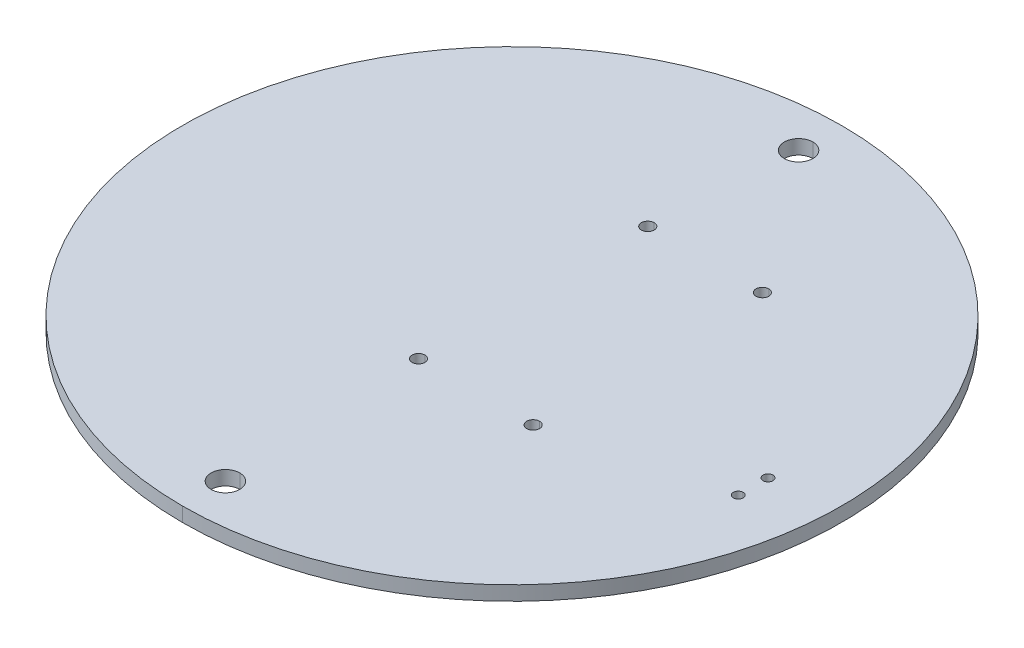
ISO-10303-21;
HEADER;
FILE_DESCRIPTION(('STEP AP214'),'2;1');
FILE_NAME('part.step','',(''),(''),'','','');
FILE_SCHEMA(('AUTOMOTIVE_DESIGN { 1 0 10303 214 1 1 1 1 }'));
ENDSEC;
DATA;
#1=APPLICATION_CONTEXT('core data for automotive mechanical design processes');
#2=APPLICATION_PROTOCOL_DEFINITION('international standard','automotive_design',2000,#1);
#3=PRODUCT_CONTEXT('',#1,'mechanical');
#4=PRODUCT('Part','Part','',(#3));
#5=PRODUCT_RELATED_PRODUCT_CATEGORY('part','',(#4));
#6=PRODUCT_DEFINITION_FORMATION('','',#4);
#7=PRODUCT_DEFINITION_CONTEXT('part definition',#1,'design');
#8=PRODUCT_DEFINITION('design','',#6,#7);
#9=PRODUCT_DEFINITION_SHAPE('','',#8);
#10=(LENGTH_UNIT() NAMED_UNIT(*) SI_UNIT(.MILLI.,.METRE.));
#11=(NAMED_UNIT(*) PLANE_ANGLE_UNIT() SI_UNIT($,.RADIAN.));
#12=(NAMED_UNIT(*) SI_UNIT($,.STERADIAN.) SOLID_ANGLE_UNIT());
#13=UNCERTAINTY_MEASURE_WITH_UNIT(LENGTH_MEASURE(1.E-05),#10,'distance_accuracy_value','');
#14=(GEOMETRIC_REPRESENTATION_CONTEXT(3) GLOBAL_UNCERTAINTY_ASSIGNED_CONTEXT((#13)) GLOBAL_UNIT_ASSIGNED_CONTEXT((#10,
#11,#12)) REPRESENTATION_CONTEXT('',''));
#15=CARTESIAN_POINT('',(0.,0.,0.));
#16=DIRECTION('',(0.,0.,1.));
#17=DIRECTION('',(1.,0.,0.));
#18=AXIS2_PLACEMENT_3D('',#15,#16,#17);
#19=CARTESIAN_POINT('',(-2.10401407491871,0.,-32.1914063011682));
#20=DIRECTION('',(0.,1.,0.));
#21=DIRECTION('',(0.,0.,1.));
#22=AXIS2_PLACEMENT_3D('',#19,#20,#21);
#23=CYLINDRICAL_SURFACE('',#22,1.4224);
#24=DIRECTION('',(0.,1.,0.));
#25=VECTOR('',#24,1.);
#26=CARTESIAN_POINT('',(-2.10401407491871,0.,-33.6138063011682));
#27=LINE('',#26,#25);
#28=CARTESIAN_POINT('',(-2.10401407491871,0.,-33.6138063011682));
#29=VERTEX_POINT('',#28);
#30=CARTESIAN_POINT('',(-2.10401407491871,3.175,-33.6138063011682));
#31=VERTEX_POINT('',#30);
#32=EDGE_CURVE('E269',#29,#31,#27,.T.);
#33=ORIENTED_EDGE('',*,*,#32,.F.);
#34=CARTESIAN_POINT('',(-2.10401407491871,0.,-32.1914063011682));
#35=DIRECTION('',(0.,1.,0.));
#36=DIRECTION('',(0.,0.,1.));
#37=AXIS2_PLACEMENT_3D('',#34,#35,#36);
#38=CIRCLE('',#37,1.4224);
#39=CARTESIAN_POINT('',(-2.10401407491871,0.,-30.7690063011682));
#40=VERTEX_POINT('',#39);
#41=EDGE_CURVE('E263',#40,#29,#38,.T.);
#42=ORIENTED_EDGE('',*,*,#41,.F.);
#43=DIRECTION('',(0.,1.,0.));
#44=VECTOR('',#43,1.);
#45=CARTESIAN_POINT('',(-2.10401407491871,0.,-30.7690063011682));
#46=LINE('',#45,#44);
#47=CARTESIAN_POINT('',(-2.10401407491871,3.175,-30.7690063011682));
#48=VERTEX_POINT('',#47);
#49=EDGE_CURVE('E284',#40,#48,#46,.T.);
#50=ORIENTED_EDGE('',*,*,#49,.T.);
#51=CARTESIAN_POINT('',(-2.10401407491871,3.175,-32.1914063011682));
#52=DIRECTION('',(0.,1.,0.));
#53=DIRECTION('',(0.,0.,1.));
#54=AXIS2_PLACEMENT_3D('',#51,#52,#53);
#55=CIRCLE('',#54,1.4224);
#56=EDGE_CURVE('E215',#48,#31,#55,.T.);
#57=ORIENTED_EDGE('',*,*,#56,.T.);
#58=EDGE_LOOP('',(#33,#42,#50,#57));
#59=FACE_BOUND('',#58,.T.);
#60=ADVANCED_FACE('F16',(#59),#23,.F.);
#61=CARTESIAN_POINT('',(-2.10401407491871,0.,18.6085936988318));
#62=DIRECTION('',(0.,1.,0.));
#63=DIRECTION('',(0.,0.,1.));
#64=AXIS2_PLACEMENT_3D('',#61,#62,#63);
#65=CYLINDRICAL_SURFACE('',#64,1.4224);
#66=DIRECTION('',(0.,1.,0.));
#67=VECTOR('',#66,1.);
#68=CARTESIAN_POINT('',(-2.10401407491871,0.,17.1861936988318));
#69=LINE('',#68,#67);
#70=CARTESIAN_POINT('',(-2.10401407491871,0.,17.1861936988318));
#71=VERTEX_POINT('',#70);
#72=CARTESIAN_POINT('',(-2.10401407491871,3.175,17.1861936988318));
#73=VERTEX_POINT('',#72);
#74=EDGE_CURVE('E241',#71,#73,#69,.T.);
#75=ORIENTED_EDGE('',*,*,#74,.F.);
#76=CARTESIAN_POINT('',(-2.10401407491871,0.,18.6085936988318));
#77=DIRECTION('',(0.,1.,0.));
#78=DIRECTION('',(0.,0.,1.));
#79=AXIS2_PLACEMENT_3D('',#76,#77,#78);
#80=CIRCLE('',#79,1.4224);
#81=CARTESIAN_POINT('',(-2.10401407491871,0.,20.0309936988318));
#82=VERTEX_POINT('',#81);
#83=EDGE_CURVE('E211',#82,#71,#80,.T.);
#84=ORIENTED_EDGE('',*,*,#83,.F.);
#85=DIRECTION('',(0.,1.,0.));
#86=VECTOR('',#85,1.);
#87=CARTESIAN_POINT('',(-2.10401407491871,0.,20.0309936988318));
#88=LINE('',#87,#86);
#89=CARTESIAN_POINT('',(-2.10401407491871,3.175,20.0309936988318));
#90=VERTEX_POINT('',#89);
#91=EDGE_CURVE('E240',#82,#90,#88,.T.);
#92=ORIENTED_EDGE('',*,*,#91,.T.);
#93=CARTESIAN_POINT('',(-2.10401407491871,3.175,18.6085936988318));
#94=DIRECTION('',(0.,1.,0.));
#95=DIRECTION('',(0.,0.,1.));
#96=AXIS2_PLACEMENT_3D('',#93,#94,#95);
#97=CIRCLE('',#96,1.4224);
#98=EDGE_CURVE('E186',#90,#73,#97,.T.);
#99=ORIENTED_EDGE('',*,*,#98,.T.);
#100=EDGE_LOOP('',(#75,#84,#92,#99));
#101=FACE_BOUND('',#100,.T.);
#102=ADVANCED_FACE('F455',(#101),#65,.F.);
#103=CARTESIAN_POINT('',(23.2959859250813,0.,18.6085936988318));
#104=DIRECTION('',(0.,1.,0.));
#105=DIRECTION('',(0.,0.,1.));
#106=AXIS2_PLACEMENT_3D('',#103,#104,#105);
#107=CYLINDRICAL_SURFACE('',#106,1.4224);
#108=DIRECTION('',(0.,1.,0.));
#109=VECTOR('',#108,1.);
#110=CARTESIAN_POINT('',(23.2959859250813,0.,17.1861936988318));
#111=LINE('',#110,#109);
#112=CARTESIAN_POINT('',(23.2959859250813,0.,17.1861936988318));
#113=VERTEX_POINT('',#112);
#114=CARTESIAN_POINT('',(23.2959859250813,3.175,17.1861936988318));
#115=VERTEX_POINT('',#114);
#116=EDGE_CURVE('E200',#113,#115,#111,.T.);
#117=ORIENTED_EDGE('',*,*,#116,.F.);
#118=CARTESIAN_POINT('',(23.2959859250813,0.,18.6085936988318));
#119=DIRECTION('',(0.,1.,0.));
#120=DIRECTION('',(0.,0.,1.));
#121=AXIS2_PLACEMENT_3D('',#118,#119,#120);
#122=CIRCLE('',#121,1.4224);
#123=CARTESIAN_POINT('',(23.2959859250813,0.,20.0309936988318));
#124=VERTEX_POINT('',#123);
#125=EDGE_CURVE('E192',#124,#113,#122,.T.);
#126=ORIENTED_EDGE('',*,*,#125,.F.);
#127=DIRECTION('',(0.,1.,0.));
#128=VECTOR('',#127,1.);
#129=CARTESIAN_POINT('',(23.2959859250813,0.,20.0309936988318));
#130=LINE('',#129,#128);
#131=CARTESIAN_POINT('',(23.2959859250813,3.175,20.0309936988318));
#132=VERTEX_POINT('',#131);
#133=EDGE_CURVE('E190',#124,#132,#130,.T.);
#134=ORIENTED_EDGE('',*,*,#133,.T.);
#135=CARTESIAN_POINT('',(23.2959859250813,3.175,18.6085936988318));
#136=DIRECTION('',(0.,1.,0.));
#137=DIRECTION('',(0.,0.,1.));
#138=AXIS2_PLACEMENT_3D('',#135,#136,#137);
#139=CIRCLE('',#138,1.4224);
#140=EDGE_CURVE('E175',#132,#115,#139,.T.);
#141=ORIENTED_EDGE('',*,*,#140,.T.);
#142=EDGE_LOOP('',(#117,#126,#134,#141));
#143=FACE_BOUND('',#142,.T.);
#144=ADVANCED_FACE('F191',(#143),#107,.F.);
#145=CARTESIAN_POINT('',(23.2959859250813,0.,-32.1914063011682));
#146=DIRECTION('',(0.,1.,0.));
#147=DIRECTION('',(0.,0.,1.));
#148=AXIS2_PLACEMENT_3D('',#145,#146,#147);
#149=CYLINDRICAL_SURFACE('',#148,1.4224);
#150=DIRECTION('',(0.,1.,0.));
#151=VECTOR('',#150,1.);
#152=CARTESIAN_POINT('',(23.2959859250813,0.,-33.6138063011682));
#153=LINE('',#152,#151);
#154=CARTESIAN_POINT('',(23.2959859250813,0.,-33.6138063011682));
#155=VERTEX_POINT('',#154);
#156=CARTESIAN_POINT('',(23.2959859250813,3.175,-33.6138063011682));
#157=VERTEX_POINT('',#156);
#158=EDGE_CURVE('E259',#155,#157,#153,.T.);
#159=ORIENTED_EDGE('',*,*,#158,.F.);
#160=CARTESIAN_POINT('',(23.2959859250813,0.,-32.1914063011682));
#161=DIRECTION('',(0.,1.,0.));
#162=DIRECTION('',(0.,0.,1.));
#163=AXIS2_PLACEMENT_3D('',#160,#161,#162);
#164=CIRCLE('',#163,1.4224);
#165=CARTESIAN_POINT('',(23.2959859250813,0.,-30.7690063011682));
#166=VERTEX_POINT('',#165);
#167=EDGE_CURVE('E277',#166,#155,#164,.T.);
#168=ORIENTED_EDGE('',*,*,#167,.F.);
#169=DIRECTION('',(0.,1.,0.));
#170=VECTOR('',#169,1.);
#171=CARTESIAN_POINT('',(23.2959859250813,0.,-30.7690063011682));
#172=LINE('',#171,#170);
#173=CARTESIAN_POINT('',(23.2959859250813,3.175,-30.7690063011682));
#174=VERTEX_POINT('',#173);
#175=EDGE_CURVE('E344',#166,#174,#172,.T.);
#176=ORIENTED_EDGE('',*,*,#175,.T.);
#177=CARTESIAN_POINT('',(23.2959859250813,3.175,-32.1914063011682));
#178=DIRECTION('',(0.,1.,0.));
#179=DIRECTION('',(0.,0.,1.));
#180=AXIS2_PLACEMENT_3D('',#177,#178,#179);
#181=CIRCLE('',#180,1.4224);
#182=EDGE_CURVE('E185',#174,#157,#181,.T.);
#183=ORIENTED_EDGE('',*,*,#182,.T.);
#184=EDGE_LOOP('',(#159,#168,#176,#183));
#185=FACE_BOUND('',#184,.T.);
#186=ADVANCED_FACE('F413',(#185),#149,.F.);
#187=CARTESIAN_POINT('',(59.4877224293933,0.,2.75495221845304));
#188=DIRECTION('',(0.,1.,0.));
#189=DIRECTION('',(0.,0.,1.));
#190=AXIS2_PLACEMENT_3D('',#187,#188,#189);
#191=CYLINDRICAL_SURFACE('',#190,1.0922);
#192=DIRECTION('',(0.,1.,0.));
#193=VECTOR('',#192,1.);
#194=CARTESIAN_POINT('',(59.4877224293933,0.,1.66275221845304));
#195=LINE('',#194,#193);
#196=CARTESIAN_POINT('',(59.4877224293933,0.,1.66275221845304));
#197=VERTEX_POINT('',#196);
#198=CARTESIAN_POINT('',(59.4877224293933,3.175,1.66275221845304));
#199=VERTEX_POINT('',#198);
#200=EDGE_CURVE('E290',#197,#199,#195,.T.);
#201=ORIENTED_EDGE('',*,*,#200,.F.);
#202=CARTESIAN_POINT('',(59.4877224293933,0.,2.75495221845304));
#203=DIRECTION('',(0.,1.,0.));
#204=DIRECTION('',(0.,0.,1.));
#205=AXIS2_PLACEMENT_3D('',#202,#203,#204);
#206=CIRCLE('',#205,1.0922);
#207=CARTESIAN_POINT('',(59.4877224293933,0.,3.84715221845304));
#208=VERTEX_POINT('',#207);
#209=EDGE_CURVE('E280',#208,#197,#206,.T.);
#210=ORIENTED_EDGE('',*,*,#209,.F.);
#211=DIRECTION('',(0.,1.,0.));
#212=VECTOR('',#211,1.);
#213=CARTESIAN_POINT('',(59.4877224293933,0.,3.84715221845304));
#214=LINE('',#213,#212);
#215=CARTESIAN_POINT('',(59.4877224293933,3.175,3.84715221845304));
#216=VERTEX_POINT('',#215);
#217=EDGE_CURVE('E251',#208,#216,#214,.T.);
#218=ORIENTED_EDGE('',*,*,#217,.T.);
#219=CARTESIAN_POINT('',(59.4877224293933,3.175,2.75495221845304));
#220=DIRECTION('',(0.,1.,0.));
#221=DIRECTION('',(0.,0.,1.));
#222=AXIS2_PLACEMENT_3D('',#219,#220,#221);
#223=CIRCLE('',#222,1.0922);
#224=EDGE_CURVE('E323',#216,#199,#223,.T.);
#225=ORIENTED_EDGE('',*,*,#224,.T.);
#226=EDGE_LOOP('',(#201,#210,#218,#225));
#227=FACE_BOUND('',#226,.T.);
#228=ADVANCED_FACE('F475',(#227),#191,.F.);
#229=CARTESIAN_POINT('',(59.4877224293933,0.,9.35895221845304));
#230=DIRECTION('',(0.,1.,0.));
#231=DIRECTION('',(0.,0.,1.));
#232=AXIS2_PLACEMENT_3D('',#229,#230,#231);
#233=CYLINDRICAL_SURFACE('',#232,1.0922);
#234=DIRECTION('',(0.,1.,0.));
#235=VECTOR('',#234,1.);
#236=CARTESIAN_POINT('',(59.4877224293933,0.,8.26675221845304));
#237=LINE('',#236,#235);
#238=CARTESIAN_POINT('',(59.4877224293933,0.,8.26675221845304));
#239=VERTEX_POINT('',#238);
#240=CARTESIAN_POINT('',(59.4877224293933,3.175,8.26675221845304));
#241=VERTEX_POINT('',#240);
#242=EDGE_CURVE('E250',#239,#241,#237,.T.);
#243=ORIENTED_EDGE('',*,*,#242,.F.);
#244=CARTESIAN_POINT('',(59.4877224293933,0.,9.35895221845304));
#245=DIRECTION('',(0.,1.,0.));
#246=DIRECTION('',(0.,0.,1.));
#247=AXIS2_PLACEMENT_3D('',#244,#245,#246);
#248=CIRCLE('',#247,1.0922);
#249=CARTESIAN_POINT('',(59.4877224293933,0.,10.451152218453));
#250=VERTEX_POINT('',#249);
#251=EDGE_CURVE('E286',#250,#239,#248,.T.);
#252=ORIENTED_EDGE('',*,*,#251,.F.);
#253=DIRECTION('',(0.,1.,0.));
#254=VECTOR('',#253,1.);
#255=CARTESIAN_POINT('',(59.4877224293933,0.,10.451152218453));
#256=LINE('',#255,#254);
#257=CARTESIAN_POINT('',(59.4877224293933,3.175,10.451152218453));
#258=VERTEX_POINT('',#257);
#259=EDGE_CURVE('E353',#250,#258,#256,.T.);
#260=ORIENTED_EDGE('',*,*,#259,.T.);
#261=CARTESIAN_POINT('',(59.4877224293933,3.175,9.35895221845304));
#262=DIRECTION('',(0.,1.,0.));
#263=DIRECTION('',(0.,0.,1.));
#264=AXIS2_PLACEMENT_3D('',#261,#262,#263);
#265=CIRCLE('',#264,1.0922);
#266=EDGE_CURVE('E325',#258,#241,#265,.T.);
#267=ORIENTED_EDGE('',*,*,#266,.T.);
#268=EDGE_LOOP('',(#243,#252,#260,#267));
#269=FACE_BOUND('',#268,.T.);
#270=ADVANCED_FACE('F472',(#269),#233,.F.);
#271=CARTESIAN_POINT('',(0.,0.,63.5));
#272=DIRECTION('',(0.,1.,0.));
#273=DIRECTION('',(0.,0.,1.));
#274=AXIS2_PLACEMENT_3D('',#271,#272,#273);
#275=CYLINDRICAL_SURFACE('',#274,3.175);
#276=DIRECTION('',(0.,1.,0.));
#277=VECTOR('',#276,1.);
#278=CARTESIAN_POINT('',(0.,0.,60.325));
#279=LINE('',#278,#277);
#280=CARTESIAN_POINT('',(0.,0.,60.325));
#281=VERTEX_POINT('',#280);
#282=CARTESIAN_POINT('',(0.,3.175,60.325));
#283=VERTEX_POINT('',#282);
#284=EDGE_CURVE('E221',#281,#283,#279,.T.);
#285=ORIENTED_EDGE('',*,*,#284,.F.);
#286=CARTESIAN_POINT('',(0.,0.,63.5));
#287=DIRECTION('',(0.,1.,0.));
#288=DIRECTION('',(0.,0.,1.));
#289=AXIS2_PLACEMENT_3D('',#286,#287,#288);
#290=CIRCLE('',#289,3.175);
#291=CARTESIAN_POINT('',(0.,0.,66.675));
#292=VERTEX_POINT('',#291);
#293=EDGE_CURVE('E27',#292,#281,#290,.T.);
#294=ORIENTED_EDGE('',*,*,#293,.F.);
#295=DIRECTION('',(0.,1.,0.));
#296=VECTOR('',#295,1.);
#297=CARTESIAN_POINT('',(0.,0.,66.675));
#298=LINE('',#297,#296);
#299=CARTESIAN_POINT('',(0.,3.175,66.675));
#300=VERTEX_POINT('',#299);
#301=EDGE_CURVE('E220',#292,#300,#298,.T.);
#302=ORIENTED_EDGE('',*,*,#301,.T.);
#303=CARTESIAN_POINT('',(0.,3.175,63.5));
#304=DIRECTION('',(0.,1.,0.));
#305=DIRECTION('',(0.,0.,1.));
#306=AXIS2_PLACEMENT_3D('',#303,#304,#305);
#307=CIRCLE('',#306,3.175);
#308=EDGE_CURVE('E264',#300,#283,#307,.T.);
#309=ORIENTED_EDGE('',*,*,#308,.T.);
#310=EDGE_LOOP('',(#285,#294,#302,#309));
#311=FACE_BOUND('',#310,.T.);
#312=ADVANCED_FACE('F402',(#311),#275,.F.);
#313=CARTESIAN_POINT('',(4.43418130033078E-13,0.,-63.5));
#314=DIRECTION('',(0.,1.,0.));
#315=DIRECTION('',(0.,0.,1.));
#316=AXIS2_PLACEMENT_3D('',#313,#314,#315);
#317=CYLINDRICAL_SURFACE('',#316,3.175);
#318=DIRECTION('',(0.,1.,0.));
#319=VECTOR('',#318,1.);
#320=CARTESIAN_POINT('',(4.43806955391807E-13,0.,-66.675));
#321=LINE('',#320,#319);
#322=CARTESIAN_POINT('',(4.43806955391807E-13,0.,-66.675));
#323=VERTEX_POINT('',#322);
#324=CARTESIAN_POINT('',(4.43806955391807E-13,3.175,-66.675));
#325=VERTEX_POINT('',#324);
#326=EDGE_CURVE('E230',#323,#325,#321,.T.);
#327=ORIENTED_EDGE('',*,*,#326,.F.);
#328=CARTESIAN_POINT('',(4.43418130033078E-13,0.,-63.5));
#329=DIRECTION('',(0.,1.,0.));
#330=DIRECTION('',(0.,0.,1.));
#331=AXIS2_PLACEMENT_3D('',#328,#329,#330);
#332=CIRCLE('',#331,3.175);
#333=CARTESIAN_POINT('',(4.43418130033078E-13,0.,-60.325));
#334=VERTEX_POINT('',#333);
#335=EDGE_CURVE('E11',#334,#323,#332,.T.);
#336=ORIENTED_EDGE('',*,*,#335,.F.);
#337=DIRECTION('',(0.,1.,0.));
#338=VECTOR('',#337,1.);
#339=CARTESIAN_POINT('',(4.43418130033078E-13,0.,-60.325));
#340=LINE('',#339,#338);
#341=CARTESIAN_POINT('',(4.43418130033078E-13,3.175,-60.325));
#342=VERTEX_POINT('',#341);
#343=EDGE_CURVE('E229',#334,#342,#340,.T.);
#344=ORIENTED_EDGE('',*,*,#343,.T.);
#345=CARTESIAN_POINT('',(4.43418130033078E-13,3.175,-63.5));
#346=DIRECTION('',(0.,1.,0.));
#347=DIRECTION('',(0.,0.,1.));
#348=AXIS2_PLACEMENT_3D('',#345,#346,#347);
#349=CIRCLE('',#348,3.175);
#350=EDGE_CURVE('E260',#342,#325,#349,.T.);
#351=ORIENTED_EDGE('',*,*,#350,.T.);
#352=EDGE_LOOP('',(#327,#336,#344,#351));
#353=FACE_BOUND('',#352,.T.);
#354=ADVANCED_FACE('F420',(#353),#317,.F.);
#355=CARTESIAN_POINT('',(0.,0.,0.));
#356=DIRECTION('',(0.,1.,0.));
#357=DIRECTION('',(1.,0.,0.));
#358=AXIS2_PLACEMENT_3D('',#355,#356,#357);
#359=PLANE('',#358);
#360=ORIENTED_EDGE('',*,*,#335,.T.);
#361=CARTESIAN_POINT('',(4.43418130033078E-13,0.,-63.5));
#362=DIRECTION('',(0.,1.,0.));
#363=DIRECTION('',(0.,0.,1.));
#364=AXIS2_PLACEMENT_3D('',#361,#362,#363);
#365=CIRCLE('',#364,3.175);
#366=EDGE_CURVE('E235',#323,#334,#365,.T.);
#367=ORIENTED_EDGE('',*,*,#366,.T.);
#368=EDGE_LOOP('',(#360,#367));
#369=FACE_BOUND('',#368,.T.);
#370=ORIENTED_EDGE('',*,*,#293,.T.);
#371=CARTESIAN_POINT('',(0.,0.,63.5));
#372=DIRECTION('',(0.,1.,0.));
#373=DIRECTION('',(0.,0.,1.));
#374=AXIS2_PLACEMENT_3D('',#371,#372,#373);
#375=CIRCLE('',#374,3.175);
#376=EDGE_CURVE('E20',#281,#292,#375,.T.);
#377=ORIENTED_EDGE('',*,*,#376,.T.);
#378=EDGE_LOOP('',(#370,#377));
#379=FACE_BOUND('',#378,.T.);
#380=ORIENTED_EDGE('',*,*,#251,.T.);
#381=CARTESIAN_POINT('',(59.4877224293933,0.,9.35895221845304));
#382=DIRECTION('',(0.,1.,0.));
#383=DIRECTION('',(0.,0.,1.));
#384=AXIS2_PLACEMENT_3D('',#381,#382,#383);
#385=CIRCLE('',#384,1.0922);
#386=EDGE_CURVE('E246',#239,#250,#385,.T.);
#387=ORIENTED_EDGE('',*,*,#386,.T.);
#388=EDGE_LOOP('',(#380,#387));
#389=FACE_BOUND('',#388,.T.);
#390=ORIENTED_EDGE('',*,*,#209,.T.);
#391=CARTESIAN_POINT('',(59.4877224293933,0.,2.75495221845304));
#392=DIRECTION('',(0.,1.,0.));
#393=DIRECTION('',(0.,0.,1.));
#394=AXIS2_PLACEMENT_3D('',#391,#392,#393);
#395=CIRCLE('',#394,1.0922);
#396=EDGE_CURVE('E295',#197,#208,#395,.T.);
#397=ORIENTED_EDGE('',*,*,#396,.T.);
#398=EDGE_LOOP('',(#390,#397));
#399=FACE_BOUND('',#398,.T.);
#400=ORIENTED_EDGE('',*,*,#167,.T.);
#401=CARTESIAN_POINT('',(23.2959859250813,0.,-32.1914063011682));
#402=DIRECTION('',(0.,1.,0.));
#403=DIRECTION('',(0.,0.,1.));
#404=AXIS2_PLACEMENT_3D('',#401,#402,#403);
#405=CIRCLE('',#404,1.4224);
#406=EDGE_CURVE('E197',#155,#166,#405,.T.);
#407=ORIENTED_EDGE('',*,*,#406,.T.);
#408=EDGE_LOOP('',(#400,#407));
#409=FACE_BOUND('',#408,.T.);
#410=ORIENTED_EDGE('',*,*,#125,.T.);
#411=CARTESIAN_POINT('',(23.2959859250813,0.,18.6085936988318));
#412=DIRECTION('',(0.,1.,0.));
#413=DIRECTION('',(0.,0.,1.));
#414=AXIS2_PLACEMENT_3D('',#411,#412,#413);
#415=CIRCLE('',#414,1.4224);
#416=EDGE_CURVE('E207',#113,#124,#415,.T.);
#417=ORIENTED_EDGE('',*,*,#416,.T.);
#418=EDGE_LOOP('',(#410,#417));
#419=FACE_BOUND('',#418,.T.);
#420=ORIENTED_EDGE('',*,*,#83,.T.);
#421=CARTESIAN_POINT('',(-2.10401407491871,0.,18.6085936988318));
#422=DIRECTION('',(0.,1.,0.));
#423=DIRECTION('',(0.,0.,1.));
#424=AXIS2_PLACEMENT_3D('',#421,#422,#423);
#425=CIRCLE('',#424,1.4224);
#426=EDGE_CURVE('E245',#71,#82,#425,.T.);
#427=ORIENTED_EDGE('',*,*,#426,.T.);
#428=EDGE_LOOP('',(#420,#427));
#429=FACE_BOUND('',#428,.T.);
#430=ORIENTED_EDGE('',*,*,#41,.T.);
#431=CARTESIAN_POINT('',(-2.10401407491871,0.,-32.1914063011682));
#432=DIRECTION('',(0.,1.,0.));
#433=DIRECTION('',(0.,0.,1.));
#434=AXIS2_PLACEMENT_3D('',#431,#432,#433);
#435=CIRCLE('',#434,1.4224);
#436=EDGE_CURVE('E265',#29,#40,#435,.T.);
#437=ORIENTED_EDGE('',*,*,#436,.T.);
#438=EDGE_LOOP('',(#430,#437));
#439=FACE_BOUND('',#438,.T.);
#440=CARTESIAN_POINT('',(0.,0.,0.));
#441=DIRECTION('',(0.,1.,0.));
#442=DIRECTION('',(0.,0.,1.));
#443=AXIS2_PLACEMENT_3D('',#440,#441,#442);
#444=CIRCLE('',#443,73.025);
#445=CARTESIAN_POINT('',(0.,0.,-73.025));
#446=VERTEX_POINT('',#445);
#447=CARTESIAN_POINT('',(0.,0.,73.025));
#448=VERTEX_POINT('',#447);
#449=EDGE_CURVE('E41',#446,#448,#444,.T.);
#450=ORIENTED_EDGE('',*,*,#449,.F.);
#451=CARTESIAN_POINT('',(0.,0.,0.));
#452=DIRECTION('',(0.,1.,0.));
#453=DIRECTION('',(0.,0.,1.));
#454=AXIS2_PLACEMENT_3D('',#451,#452,#453);
#455=CIRCLE('',#454,73.025);
#456=EDGE_CURVE('E276',#448,#446,#455,.T.);
#457=ORIENTED_EDGE('',*,*,#456,.F.);
#458=EDGE_LOOP('',(#450,#457));
#459=FACE_BOUND('',#458,.T.);
#460=ADVANCED_FACE('F395',(#369,#379,#389,#399,#409,#419,#429,#439,#459),#359,.F.);
#461=CARTESIAN_POINT('',(0.,3.175,0.));
#462=DIRECTION('',(0.,1.,0.));
#463=DIRECTION('',(1.,0.,0.));
#464=AXIS2_PLACEMENT_3D('',#461,#462,#463);
#465=PLANE('',#464);
#466=ORIENTED_EDGE('',*,*,#350,.F.);
#467=CARTESIAN_POINT('',(4.43418130033078E-13,3.175,-63.5));
#468=DIRECTION('',(0.,1.,0.));
#469=DIRECTION('',(0.,0.,1.));
#470=AXIS2_PLACEMENT_3D('',#467,#468,#469);
#471=CIRCLE('',#470,3.175);
#472=EDGE_CURVE('E226',#325,#342,#471,.T.);
#473=ORIENTED_EDGE('',*,*,#472,.F.);
#474=EDGE_LOOP('',(#466,#473));
#475=FACE_BOUND('',#474,.T.);
#476=ORIENTED_EDGE('',*,*,#308,.F.);
#477=CARTESIAN_POINT('',(0.,3.175,63.5));
#478=DIRECTION('',(0.,1.,0.));
#479=DIRECTION('',(0.,0.,1.));
#480=AXIS2_PLACEMENT_3D('',#477,#478,#479);
#481=CIRCLE('',#480,3.175);
#482=EDGE_CURVE('E217',#283,#300,#481,.T.);
#483=ORIENTED_EDGE('',*,*,#482,.F.);
#484=EDGE_LOOP('',(#476,#483));
#485=FACE_BOUND('',#484,.T.);
#486=ORIENTED_EDGE('',*,*,#266,.F.);
#487=CARTESIAN_POINT('',(59.4877224293933,3.175,9.35895221845304));
#488=DIRECTION('',(0.,1.,0.));
#489=DIRECTION('',(0.,0.,1.));
#490=AXIS2_PLACEMENT_3D('',#487,#488,#489);
#491=CIRCLE('',#490,1.0922);
#492=EDGE_CURVE('E350',#241,#258,#491,.T.);
#493=ORIENTED_EDGE('',*,*,#492,.F.);
#494=EDGE_LOOP('',(#486,#493));
#495=FACE_BOUND('',#494,.T.);
#496=ORIENTED_EDGE('',*,*,#224,.F.);
#497=CARTESIAN_POINT('',(59.4877224293933,3.175,2.75495221845304));
#498=DIRECTION('',(0.,1.,0.));
#499=DIRECTION('',(0.,0.,1.));
#500=AXIS2_PLACEMENT_3D('',#497,#498,#499);
#501=CIRCLE('',#500,1.0922);
#502=EDGE_CURVE('E294',#199,#216,#501,.T.);
#503=ORIENTED_EDGE('',*,*,#502,.F.);
#504=EDGE_LOOP('',(#496,#503));
#505=FACE_BOUND('',#504,.T.);
#506=ORIENTED_EDGE('',*,*,#182,.F.);
#507=CARTESIAN_POINT('',(23.2959859250813,3.175,-32.1914063011682));
#508=DIRECTION('',(0.,1.,0.));
#509=DIRECTION('',(0.,0.,1.));
#510=AXIS2_PLACEMENT_3D('',#507,#508,#509);
#511=CIRCLE('',#510,1.4224);
#512=EDGE_CURVE('E273',#157,#174,#511,.T.);
#513=ORIENTED_EDGE('',*,*,#512,.F.);
#514=EDGE_LOOP('',(#506,#513));
#515=FACE_BOUND('',#514,.T.);
#516=ORIENTED_EDGE('',*,*,#140,.F.);
#517=CARTESIAN_POINT('',(23.2959859250813,3.175,18.6085936988318));
#518=DIRECTION('',(0.,1.,0.));
#519=DIRECTION('',(0.,0.,1.));
#520=AXIS2_PLACEMENT_3D('',#517,#518,#519);
#521=CIRCLE('',#520,1.4224);
#522=EDGE_CURVE('E180',#115,#132,#521,.T.);
#523=ORIENTED_EDGE('',*,*,#522,.F.);
#524=EDGE_LOOP('',(#516,#523));
#525=FACE_BOUND('',#524,.T.);
#526=ORIENTED_EDGE('',*,*,#98,.F.);
#527=CARTESIAN_POINT('',(-2.10401407491871,3.175,18.6085936988318));
#528=DIRECTION('',(0.,1.,0.));
#529=DIRECTION('',(0.,0.,1.));
#530=AXIS2_PLACEMENT_3D('',#527,#528,#529);
#531=CIRCLE('',#530,1.4224);
#532=EDGE_CURVE('E236',#73,#90,#531,.T.);
#533=ORIENTED_EDGE('',*,*,#532,.F.);
#534=EDGE_LOOP('',(#526,#533));
#535=FACE_BOUND('',#534,.T.);
#536=ORIENTED_EDGE('',*,*,#56,.F.);
#537=CARTESIAN_POINT('',(-2.10401407491871,3.175,-32.1914063011682));
#538=DIRECTION('',(0.,1.,0.));
#539=DIRECTION('',(0.,0.,1.));
#540=AXIS2_PLACEMENT_3D('',#537,#538,#539);
#541=CIRCLE('',#540,1.4224);
#542=EDGE_CURVE('E305',#31,#48,#541,.T.);
#543=ORIENTED_EDGE('',*,*,#542,.F.);
#544=EDGE_LOOP('',(#536,#543));
#545=FACE_BOUND('',#544,.T.);
#546=CARTESIAN_POINT('',(0.,3.175,0.));
#547=DIRECTION('',(0.,1.,0.));
#548=DIRECTION('',(0.,0.,1.));
#549=AXIS2_PLACEMENT_3D('',#546,#547,#548);
#550=CIRCLE('',#549,73.025);
#551=CARTESIAN_POINT('',(0.,3.175,-73.025));
#552=VERTEX_POINT('',#551);
#553=CARTESIAN_POINT('',(0.,3.175,73.025));
#554=VERTEX_POINT('',#553);
#555=EDGE_CURVE('E216',#552,#554,#550,.T.);
#556=ORIENTED_EDGE('',*,*,#555,.T.);
#557=CARTESIAN_POINT('',(0.,3.175,0.));
#558=DIRECTION('',(0.,1.,0.));
#559=DIRECTION('',(0.,0.,1.));
#560=AXIS2_PLACEMENT_3D('',#557,#558,#559);
#561=CIRCLE('',#560,73.025);
#562=EDGE_CURVE('E255',#554,#552,#561,.T.);
#563=ORIENTED_EDGE('',*,*,#562,.T.);
#564=EDGE_LOOP('',(#556,#563));
#565=FACE_BOUND('',#564,.T.);
#566=ADVANCED_FACE('F177',(#475,#485,#495,#505,#515,#525,#535,#545,#565),#465,.T.);
#567=CARTESIAN_POINT('',(0.,3.175,0.));
#568=DIRECTION('',(0.,-1.,0.));
#569=DIRECTION('',(0.,0.,-1.));
#570=AXIS2_PLACEMENT_3D('',#567,#568,#569);
#571=CYLINDRICAL_SURFACE('',#570,73.025);
#572=DIRECTION('',(0.,-1.,0.));
#573=VECTOR('',#572,1.);
#574=CARTESIAN_POINT('',(0.,3.175,73.025));
#575=LINE('',#574,#573);
#576=EDGE_CURVE('E322',#554,#448,#575,.T.);
#577=ORIENTED_EDGE('',*,*,#576,.F.);
#578=ORIENTED_EDGE('',*,*,#555,.F.);
#579=DIRECTION('',(0.,-1.,0.));
#580=VECTOR('',#579,1.);
#581=CARTESIAN_POINT('',(0.,3.175,-73.025));
#582=LINE('',#581,#580);
#583=EDGE_CURVE('E225',#552,#446,#582,.T.);
#584=ORIENTED_EDGE('',*,*,#583,.T.);
#585=ORIENTED_EDGE('',*,*,#449,.T.);
#586=EDGE_LOOP('',(#577,#578,#584,#585));
#587=FACE_BOUND('',#586,.T.);
#588=ADVANCED_FACE('F406',(#587),#571,.T.);
#589=CARTESIAN_POINT('',(0.,3.175,0.));
#590=DIRECTION('',(0.,-1.,0.));
#591=DIRECTION('',(0.,0.,-1.));
#592=AXIS2_PLACEMENT_3D('',#589,#590,#591);
#593=CYLINDRICAL_SURFACE('',#592,73.025);
#594=ORIENTED_EDGE('',*,*,#562,.F.);
#595=ORIENTED_EDGE('',*,*,#576,.T.);
#596=ORIENTED_EDGE('',*,*,#456,.T.);
#597=ORIENTED_EDGE('',*,*,#583,.F.);
#598=EDGE_LOOP('',(#594,#595,#596,#597));
#599=FACE_BOUND('',#598,.T.);
#600=ADVANCED_FACE('F440',(#599),#593,.T.);
#601=CARTESIAN_POINT('',(4.43418130033078E-13,0.,-63.5));
#602=DIRECTION('',(0.,1.,0.));
#603=DIRECTION('',(0.,0.,1.));
#604=AXIS2_PLACEMENT_3D('',#601,#602,#603);
#605=CYLINDRICAL_SURFACE('',#604,3.175);
#606=ORIENTED_EDGE('',*,*,#366,.F.);
#607=ORIENTED_EDGE('',*,*,#326,.T.);
#608=ORIENTED_EDGE('',*,*,#472,.T.);
#609=ORIENTED_EDGE('',*,*,#343,.F.);
#610=EDGE_LOOP('',(#606,#607,#608,#609));
#611=FACE_BOUND('',#610,.T.);
#612=ADVANCED_FACE('F442',(#611),#605,.F.);
#613=CARTESIAN_POINT('',(0.,0.,63.5));
#614=DIRECTION('',(0.,1.,0.));
#615=DIRECTION('',(0.,0.,1.));
#616=AXIS2_PLACEMENT_3D('',#613,#614,#615);
#617=CYLINDRICAL_SURFACE('',#616,3.175);
#618=ORIENTED_EDGE('',*,*,#376,.F.);
#619=ORIENTED_EDGE('',*,*,#284,.T.);
#620=ORIENTED_EDGE('',*,*,#482,.T.);
#621=ORIENTED_EDGE('',*,*,#301,.F.);
#622=EDGE_LOOP('',(#618,#619,#620,#621));
#623=FACE_BOUND('',#622,.T.);
#624=ADVANCED_FACE('F18',(#623),#617,.F.);
#625=CARTESIAN_POINT('',(59.4877224293933,0.,9.35895221845304));
#626=DIRECTION('',(0.,1.,0.));
#627=DIRECTION('',(0.,0.,1.));
#628=AXIS2_PLACEMENT_3D('',#625,#626,#627);
#629=CYLINDRICAL_SURFACE('',#628,1.0922);
#630=ORIENTED_EDGE('',*,*,#386,.F.);
#631=ORIENTED_EDGE('',*,*,#242,.T.);
#632=ORIENTED_EDGE('',*,*,#492,.T.);
#633=ORIENTED_EDGE('',*,*,#259,.F.);
#634=EDGE_LOOP('',(#630,#631,#632,#633));
#635=FACE_BOUND('',#634,.T.);
#636=ADVANCED_FACE('F490',(#635),#629,.F.);
#637=CARTESIAN_POINT('',(59.4877224293933,0.,2.75495221845304));
#638=DIRECTION('',(0.,1.,0.));
#639=DIRECTION('',(0.,0.,1.));
#640=AXIS2_PLACEMENT_3D('',#637,#638,#639);
#641=CYLINDRICAL_SURFACE('',#640,1.0922);
#642=ORIENTED_EDGE('',*,*,#396,.F.);
#643=ORIENTED_EDGE('',*,*,#200,.T.);
#644=ORIENTED_EDGE('',*,*,#502,.T.);
#645=ORIENTED_EDGE('',*,*,#217,.F.);
#646=EDGE_LOOP('',(#642,#643,#644,#645));
#647=FACE_BOUND('',#646,.T.);
#648=ADVANCED_FACE('F486',(#647),#641,.F.);
#649=CARTESIAN_POINT('',(23.2959859250813,0.,-32.1914063011682));
#650=DIRECTION('',(0.,1.,0.));
#651=DIRECTION('',(0.,0.,1.));
#652=AXIS2_PLACEMENT_3D('',#649,#650,#651);
#653=CYLINDRICAL_SURFACE('',#652,1.4224);
#654=ORIENTED_EDGE('',*,*,#406,.F.);
#655=ORIENTED_EDGE('',*,*,#158,.T.);
#656=ORIENTED_EDGE('',*,*,#512,.T.);
#657=ORIENTED_EDGE('',*,*,#175,.F.);
#658=EDGE_LOOP('',(#654,#655,#656,#657));
#659=FACE_BOUND('',#658,.T.);
#660=ADVANCED_FACE('F416',(#659),#653,.F.);
#661=CARTESIAN_POINT('',(23.2959859250813,0.,18.6085936988318));
#662=DIRECTION('',(0.,1.,0.));
#663=DIRECTION('',(0.,0.,1.));
#664=AXIS2_PLACEMENT_3D('',#661,#662,#663);
#665=CYLINDRICAL_SURFACE('',#664,1.4224);
#666=ORIENTED_EDGE('',*,*,#416,.F.);
#667=ORIENTED_EDGE('',*,*,#116,.T.);
#668=ORIENTED_EDGE('',*,*,#522,.T.);
#669=ORIENTED_EDGE('',*,*,#133,.F.);
#670=EDGE_LOOP('',(#666,#667,#668,#669));
#671=FACE_BOUND('',#670,.T.);
#672=ADVANCED_FACE('F199',(#671),#665,.F.);
#673=CARTESIAN_POINT('',(-2.10401407491871,0.,18.6085936988318));
#674=DIRECTION('',(0.,1.,0.));
#675=DIRECTION('',(0.,0.,1.));
#676=AXIS2_PLACEMENT_3D('',#673,#674,#675);
#677=CYLINDRICAL_SURFACE('',#676,1.4224);
#678=ORIENTED_EDGE('',*,*,#426,.F.);
#679=ORIENTED_EDGE('',*,*,#74,.T.);
#680=ORIENTED_EDGE('',*,*,#532,.T.);
#681=ORIENTED_EDGE('',*,*,#91,.F.);
#682=EDGE_LOOP('',(#678,#679,#680,#681));
#683=FACE_BOUND('',#682,.T.);
#684=ADVANCED_FACE('F466',(#683),#677,.F.);
#685=CARTESIAN_POINT('',(-2.10401407491871,0.,-32.1914063011682));
#686=DIRECTION('',(0.,1.,0.));
#687=DIRECTION('',(0.,0.,1.));
#688=AXIS2_PLACEMENT_3D('',#685,#686,#687);
#689=CYLINDRICAL_SURFACE('',#688,1.4224);
#690=ORIENTED_EDGE('',*,*,#436,.F.);
#691=ORIENTED_EDGE('',*,*,#32,.T.);
#692=ORIENTED_EDGE('',*,*,#542,.T.);
#693=ORIENTED_EDGE('',*,*,#49,.F.);
#694=EDGE_LOOP('',(#690,#691,#692,#693));
#695=FACE_BOUND('',#694,.T.);
#696=ADVANCED_FACE('F432',(#695),#689,.F.);
#697=CLOSED_SHELL('',(#60,#102,#144,#186,#228,#270,#312,#354,#460,#566,#588,#600,#612,#624,#636,
#648,#660,#672,#684,#696));
#698=MANIFOLD_SOLID_BREP('B1',#697);
#699=ADVANCED_BREP_SHAPE_REPRESENTATION('',(#18,#698),#14);
#700=SHAPE_DEFINITION_REPRESENTATION(#9,#699);
ENDSEC;
END-ISO-10303-21;
